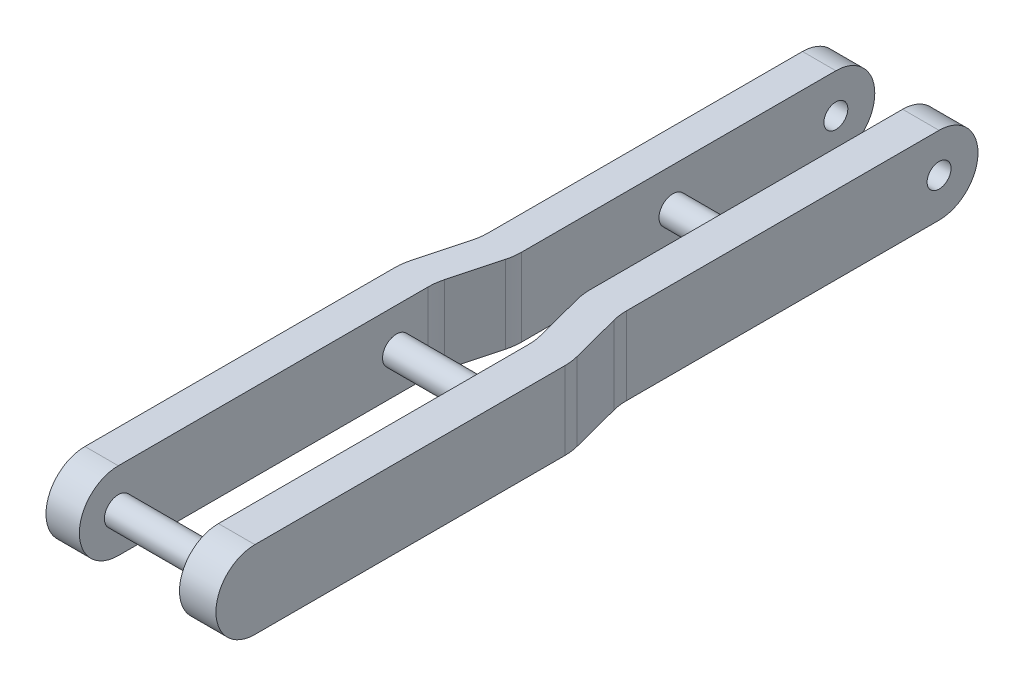
ISO-10303-21;
HEADER;
FILE_DESCRIPTION(('STEP AP214'),'2;1');
FILE_NAME('part.step','',(''),(''),'','','');
FILE_SCHEMA(('AUTOMOTIVE_DESIGN { 1 0 10303 214 1 1 1 1 }'));
ENDSEC;
DATA;
#1=APPLICATION_CONTEXT('core data for automotive mechanical design processes');
#2=APPLICATION_PROTOCOL_DEFINITION('international standard','automotive_design',2000,#1);
#3=PRODUCT_CONTEXT('',#1,'mechanical');
#4=PRODUCT('Part','Part','',(#3));
#5=PRODUCT_RELATED_PRODUCT_CATEGORY('part','',(#4));
#6=PRODUCT_DEFINITION_FORMATION('','',#4);
#7=PRODUCT_DEFINITION_CONTEXT('part definition',#1,'design');
#8=PRODUCT_DEFINITION('design','',#6,#7);
#9=PRODUCT_DEFINITION_SHAPE('','',#8);
#10=(LENGTH_UNIT() NAMED_UNIT(*) SI_UNIT(.MILLI.,.METRE.));
#11=(NAMED_UNIT(*) PLANE_ANGLE_UNIT() SI_UNIT($,.RADIAN.));
#12=(NAMED_UNIT(*) SI_UNIT($,.STERADIAN.) SOLID_ANGLE_UNIT());
#13=UNCERTAINTY_MEASURE_WITH_UNIT(LENGTH_MEASURE(1.E-05),#10,'distance_accuracy_value','');
#14=(GEOMETRIC_REPRESENTATION_CONTEXT(3) GLOBAL_UNCERTAINTY_ASSIGNED_CONTEXT((#13)) GLOBAL_UNIT_ASSIGNED_CONTEXT((#10,
#11,#12)) REPRESENTATION_CONTEXT('',''));
#15=CARTESIAN_POINT('',(0.,0.,0.));
#16=DIRECTION('',(0.,0.,1.));
#17=DIRECTION('',(1.,0.,0.));
#18=AXIS2_PLACEMENT_3D('',#15,#16,#17);
#19=CARTESIAN_POINT('',(2.,7.,-133.));
#20=DIRECTION('',(-1.,0.,0.));
#21=DIRECTION('',(0.,0.,1.));
#22=AXIS2_PLACEMENT_3D('',#19,#20,#21);
#23=CYLINDRICAL_SURFACE('',#22,7.);
#24=DIRECTION('',(1.,0.,0.));
#25=VECTOR('',#24,1.);
#26=CARTESIAN_POINT('',(2.,14.,-133.));
#27=LINE('',#26,#25);
#28=CARTESIAN_POINT('',(2.,14.,-133.));
#29=VERTEX_POINT('',#28);
#30=CARTESIAN_POINT('',(-4.55341928222709,14.,-133.));
#31=VERTEX_POINT('',#30);
#32=EDGE_CURVE('E337',#29,#31,#27,.F.);
#33=ORIENTED_EDGE('',*,*,#32,.F.);
#34=CARTESIAN_POINT('',(2.,7.,-133.));
#35=DIRECTION('',(-1.,0.,0.));
#36=DIRECTION('',(0.,0.,1.));
#37=AXIS2_PLACEMENT_3D('',#34,#35,#36);
#38=CIRCLE('',#37,7.);
#39=CARTESIAN_POINT('',(2.,0.,-133.));
#40=VERTEX_POINT('',#39);
#41=EDGE_CURVE('E56',#40,#29,#38,.F.);
#42=ORIENTED_EDGE('',*,*,#41,.F.);
#43=DIRECTION('',(-1.,0.,0.));
#44=VECTOR('',#43,1.);
#45=CARTESIAN_POINT('',(-11.5534192822271,0.,-133.));
#46=LINE('',#45,#44);
#47=CARTESIAN_POINT('',(-4.55341928222709,0.,-133.));
#48=VERTEX_POINT('',#47);
#49=EDGE_CURVE('E340',#48,#40,#46,.F.);
#50=ORIENTED_EDGE('',*,*,#49,.F.);
#51=CARTESIAN_POINT('',(-4.55341928222709,7.,-133.));
#52=DIRECTION('',(1.,0.,0.));
#53=DIRECTION('',(0.,0.,-1.));
#54=AXIS2_PLACEMENT_3D('',#51,#52,#53);
#55=CIRCLE('',#54,7.);
#56=EDGE_CURVE('E64',#31,#48,#55,.F.);
#57=ORIENTED_EDGE('',*,*,#56,.F.);
#58=EDGE_LOOP('',(#33,#42,#50,#57));
#59=FACE_BOUND('',#58,.T.);
#60=ADVANCED_FACE('F41',(#59),#23,.T.);
#61=CARTESIAN_POINT('',(-1.55341928222709,7.,-7.));
#62=DIRECTION('',(1.,0.,0.));
#63=DIRECTION('',(0.,0.,-1.));
#64=AXIS2_PLACEMENT_3D('',#61,#62,#63);
#65=CYLINDRICAL_SURFACE('',#64,7.);
#66=DIRECTION('',(-1.,0.,0.));
#67=VECTOR('',#66,1.);
#68=CARTESIAN_POINT('',(-1.55341928222709,14.,-7.));
#69=LINE('',#68,#67);
#70=CARTESIAN_POINT('',(-1.55341928222709,14.,-7.));
#71=VERTEX_POINT('',#70);
#72=CARTESIAN_POINT('',(5.,14.,-7.));
#73=VERTEX_POINT('',#72);
#74=EDGE_CURVE('E327',#71,#73,#69,.F.);
#75=ORIENTED_EDGE('',*,*,#74,.F.);
#76=CARTESIAN_POINT('',(-1.55341928222709,7.,-7.));
#77=DIRECTION('',(1.,0.,0.));
#78=DIRECTION('',(0.,0.,-1.));
#79=AXIS2_PLACEMENT_3D('',#76,#77,#78);
#80=CIRCLE('',#79,7.);
#81=CARTESIAN_POINT('',(-1.55341928222709,0.,-7.));
#82=VERTEX_POINT('',#81);
#83=EDGE_CURVE('E333',#82,#71,#80,.F.);
#84=ORIENTED_EDGE('',*,*,#83,.F.);
#85=DIRECTION('',(1.,0.,0.));
#86=VECTOR('',#85,1.);
#87=CARTESIAN_POINT('',(-11.5534192822271,0.,-7.));
#88=LINE('',#87,#86);
#89=CARTESIAN_POINT('',(5.,0.,-7.));
#90=VERTEX_POINT('',#89);
#91=EDGE_CURVE('E330',#90,#82,#88,.F.);
#92=ORIENTED_EDGE('',*,*,#91,.F.);
#93=CARTESIAN_POINT('',(5.,7.,-7.));
#94=DIRECTION('',(-1.,0.,0.));
#95=DIRECTION('',(0.,0.,1.));
#96=AXIS2_PLACEMENT_3D('',#93,#94,#95);
#97=CIRCLE('',#96,7.);
#98=EDGE_CURVE('E335',#73,#90,#97,.F.);
#99=ORIENTED_EDGE('',*,*,#98,.F.);
#100=EDGE_LOOP('',(#75,#84,#92,#99));
#101=FACE_BOUND('',#100,.T.);
#102=ADVANCED_FACE('F485',(#101),#65,.T.);
#103=CARTESIAN_POINT('',(5.,14.,0.));
#104=DIRECTION('',(-1.,0.,0.));
#105=DIRECTION('',(0.,0.,1.));
#106=AXIS2_PLACEMENT_3D('',#103,#104,#105);
#107=PLANE('',#106);
#108=DIRECTION('',(0.,0.,-1.));
#109=VECTOR('',#108,1.);
#110=CARTESIAN_POINT('',(5.,14.,0.));
#111=LINE('',#110,#109);
#112=CARTESIAN_POINT('',(5.,14.,-62.7180489145873));
#113=VERTEX_POINT('',#112);
#114=EDGE_CURVE('E260',#73,#113,#111,.T.);
#115=ORIENTED_EDGE('',*,*,#114,.F.);
#116=ORIENTED_EDGE('',*,*,#98,.T.);
#117=DIRECTION('',(0.,0.,-1.));
#118=VECTOR('',#117,1.);
#119=CARTESIAN_POINT('',(5.,0.,0.));
#120=LINE('',#119,#118);
#121=CARTESIAN_POINT('',(5.,0.,-62.7180489145873));
#122=VERTEX_POINT('',#121);
#123=EDGE_CURVE('E259',#90,#122,#120,.T.);
#124=ORIENTED_EDGE('',*,*,#123,.T.);
#125=DIRECTION('',(0.,-1.,0.));
#126=VECTOR('',#125,1.);
#127=CARTESIAN_POINT('',(5.,14.,-62.7180489145873));
#128=LINE('',#127,#126);
#129=EDGE_CURVE('E324',#113,#122,#128,.T.);
#130=ORIENTED_EDGE('',*,*,#129,.F.);
#131=EDGE_LOOP('',(#115,#116,#124,#130));
#132=FACE_BOUND('',#131,.T.);
#133=ADVANCED_FACE('F491',(#132),#107,.F.);
#134=CARTESIAN_POINT('',(-5.,14.,-62.7180489145873));
#135=DIRECTION('',(0.,-1.,0.));
#136=DIRECTION('',(0.,0.,-1.));
#137=AXIS2_PLACEMENT_3D('',#134,#135,#136);
#138=CYLINDRICAL_SURFACE('',#137,10.);
#139=CARTESIAN_POINT('',(-5.,0.,-62.7180489145873));
#140=DIRECTION('',(0.,1.,0.));
#141=DIRECTION('',(0.,0.,1.));
#142=AXIS2_PLACEMENT_3D('',#139,#140,#141);
#143=CIRCLE('',#142,10.);
#144=CARTESIAN_POINT('',(4.67663446750844,0.,-65.2404972058765));
#145=VERTEX_POINT('',#144);
#146=EDGE_CURVE('E285',#122,#145,#143,.T.);
#147=ORIENTED_EDGE('',*,*,#146,.T.);
#148=DIRECTION('',(0.,-1.,0.));
#149=VECTOR('',#148,1.);
#150=CARTESIAN_POINT('',(4.67663446750844,14.,-65.2404972058765));
#151=LINE('',#150,#149);
#152=CARTESIAN_POINT('',(4.67663446750844,14.,-65.2404972058765));
#153=VERTEX_POINT('',#152);
#154=EDGE_CURVE('E321',#153,#145,#151,.T.);
#155=ORIENTED_EDGE('',*,*,#154,.F.);
#156=CARTESIAN_POINT('',(-5.,14.,-62.7180489145873));
#157=DIRECTION('',(0.,1.,0.));
#158=DIRECTION('',(0.,0.,1.));
#159=AXIS2_PLACEMENT_3D('',#156,#157,#158);
#160=CIRCLE('',#159,10.);
#161=EDGE_CURVE('E262',#113,#153,#160,.T.);
#162=ORIENTED_EDGE('',*,*,#161,.F.);
#163=ORIENTED_EDGE('',*,*,#129,.T.);
#164=EDGE_LOOP('',(#147,#155,#162,#163));
#165=FACE_BOUND('',#164,.T.);
#166=ADVANCED_FACE('F537',(#165),#138,.T.);
#167=CARTESIAN_POINT('',(4.67663446750844,14.,-65.2404972058765));
#168=DIRECTION('',(-0.967663446750844,0.,0.252244829128915));
#169=DIRECTION('',(0.252244829128915,0.,0.967663446750844));
#170=AXIS2_PLACEMENT_3D('',#167,#168,#169);
#171=PLANE('',#170);
#172=DIRECTION('',(-0.252244829128915,0.,-0.967663446750844));
#173=VECTOR('',#172,1.);
#174=CARTESIAN_POINT('',(4.67663446750844,0.,-65.2404972058765));
#175=LINE('',#174,#173);
#176=CARTESIAN_POINT('',(2.32336553249156,0.,-74.2681245973039));
#177=VERTEX_POINT('',#176);
#178=EDGE_CURVE('E287',#145,#177,#175,.T.);
#179=ORIENTED_EDGE('',*,*,#178,.T.);
#180=DIRECTION('',(0.,-1.,0.));
#181=VECTOR('',#180,1.);
#182=CARTESIAN_POINT('',(2.32336553249156,14.,-74.2681245973039));
#183=LINE('',#182,#181);
#184=CARTESIAN_POINT('',(2.32336553249156,14.,-74.2681245973039));
#185=VERTEX_POINT('',#184);
#186=EDGE_CURVE('E318',#185,#177,#183,.T.);
#187=ORIENTED_EDGE('',*,*,#186,.F.);
#188=DIRECTION('',(-0.252244829128915,0.,-0.967663446750844));
#189=VECTOR('',#188,1.);
#190=CARTESIAN_POINT('',(4.67663446750844,14.,-65.2404972058765));
#191=LINE('',#190,#189);
#192=EDGE_CURVE('E265',#153,#185,#191,.T.);
#193=ORIENTED_EDGE('',*,*,#192,.F.);
#194=ORIENTED_EDGE('',*,*,#154,.T.);
#195=EDGE_LOOP('',(#179,#187,#193,#194));
#196=FACE_BOUND('',#195,.T.);
#197=ADVANCED_FACE('F541',(#196),#171,.F.);
#198=CARTESIAN_POINT('',(12.,14.,-76.7905728885931));
#199=DIRECTION('',(0.,-1.,0.));
#200=DIRECTION('',(0.,0.,-1.));
#201=AXIS2_PLACEMENT_3D('',#198,#199,#200);
#202=CYLINDRICAL_SURFACE('',#201,10.);
#203=CARTESIAN_POINT('',(12.,0.,-76.7905728885931));
#204=DIRECTION('',(0.,-1.,0.));
#205=DIRECTION('',(0.,0.,-1.));
#206=AXIS2_PLACEMENT_3D('',#203,#204,#205);
#207=CIRCLE('',#206,10.);
#208=CARTESIAN_POINT('',(2.,0.,-76.7905728885931));
#209=VERTEX_POINT('',#208);
#210=EDGE_CURVE('E289',#177,#209,#207,.T.);
#211=ORIENTED_EDGE('',*,*,#210,.T.);
#212=DIRECTION('',(0.,-1.,0.));
#213=VECTOR('',#212,1.);
#214=CARTESIAN_POINT('',(2.,14.,-76.7905728885931));
#215=LINE('',#214,#213);
#216=CARTESIAN_POINT('',(2.,14.,-76.7905728885931));
#217=VERTEX_POINT('',#216);
#218=EDGE_CURVE('E315',#217,#209,#215,.T.);
#219=ORIENTED_EDGE('',*,*,#218,.F.);
#220=CARTESIAN_POINT('',(12.,14.,-76.7905728885931));
#221=DIRECTION('',(0.,-1.,0.));
#222=DIRECTION('',(0.,0.,-1.));
#223=AXIS2_PLACEMENT_3D('',#220,#221,#222);
#224=CIRCLE('',#223,10.);
#225=EDGE_CURVE('E267',#185,#217,#224,.T.);
#226=ORIENTED_EDGE('',*,*,#225,.F.);
#227=ORIENTED_EDGE('',*,*,#186,.T.);
#228=EDGE_LOOP('',(#211,#219,#226,#227));
#229=FACE_BOUND('',#228,.T.);
#230=ADVANCED_FACE('F543',(#229),#202,.F.);
#231=CARTESIAN_POINT('',(2.,14.,-76.7905728885931));
#232=DIRECTION('',(-1.,0.,0.));
#233=DIRECTION('',(0.,0.,1.));
#234=AXIS2_PLACEMENT_3D('',#231,#232,#233);
#235=PLANE('',#234);
#236=CARTESIAN_POINT('',(2.,7.,-133.));
#237=DIRECTION('',(1.,0.,0.));
#238=DIRECTION('',(0.,0.,-1.));
#239=AXIS2_PLACEMENT_3D('',#236,#237,#238);
#240=CIRCLE('',#239,2.15000000000002);
#241=CARTESIAN_POINT('',(2.,7.,-135.15));
#242=VERTEX_POINT('',#241);
#243=EDGE_CURVE('E253',#242,#242,#240,.T.);
#244=ORIENTED_EDGE('',*,*,#243,.F.);
#245=EDGE_LOOP('',(#244));
#246=FACE_BOUND('',#245,.T.);
#247=DIRECTION('',(0.,0.,-1.));
#248=VECTOR('',#247,1.);
#249=CARTESIAN_POINT('',(2.,0.,-76.7905728885931));
#250=LINE('',#249,#248);
#251=EDGE_CURVE('E291',#209,#40,#250,.T.);
#252=ORIENTED_EDGE('',*,*,#251,.T.);
#253=ORIENTED_EDGE('',*,*,#41,.T.);
#254=DIRECTION('',(0.,0.,-1.));
#255=VECTOR('',#254,1.);
#256=CARTESIAN_POINT('',(2.,14.,-76.7905728885931));
#257=LINE('',#256,#255);
#258=EDGE_CURVE('E269',#217,#29,#257,.T.);
#259=ORIENTED_EDGE('',*,*,#258,.F.);
#260=ORIENTED_EDGE('',*,*,#218,.T.);
#261=EDGE_LOOP('',(#252,#253,#259,#260));
#262=FACE_BOUND('',#261,.T.);
#263=ADVANCED_FACE('F499',(#246,#262),#235,.F.);
#264=CARTESIAN_POINT('',(-4.55341928222709,14.,-76.7905728885931));
#265=DIRECTION('',(1.,0.,0.));
#266=DIRECTION('',(0.,0.,-1.));
#267=AXIS2_PLACEMENT_3D('',#264,#265,#266);
#268=PLANE('',#267);
#269=CARTESIAN_POINT('',(-4.55341928222709,7.,-103.7));
#270=DIRECTION('',(1.,0.,0.));
#271=DIRECTION('',(0.,0.,-1.));
#272=AXIS2_PLACEMENT_3D('',#269,#270,#271);
#273=CIRCLE('',#272,2.49999999999999);
#274=CARTESIAN_POINT('',(-4.55341928222709,7.,-106.2));
#275=VERTEX_POINT('',#274);
#276=EDGE_CURVE('E11',#275,#275,#273,.F.);
#277=ORIENTED_EDGE('',*,*,#276,.F.);
#278=EDGE_LOOP('',(#277));
#279=FACE_BOUND('',#278,.T.);
#280=CARTESIAN_POINT('',(-4.55341928222709,7.,-133.));
#281=DIRECTION('',(1.,0.,0.));
#282=DIRECTION('',(0.,0.,-1.));
#283=AXIS2_PLACEMENT_3D('',#280,#281,#282);
#284=CIRCLE('',#283,2.15000000000002);
#285=CARTESIAN_POINT('',(-4.55341928222709,7.,-135.15));
#286=VERTEX_POINT('',#285);
#287=EDGE_CURVE('E256',#286,#286,#284,.F.);
#288=ORIENTED_EDGE('',*,*,#287,.F.);
#289=EDGE_LOOP('',(#288));
#290=FACE_BOUND('',#289,.T.);
#291=DIRECTION('',(0.,0.,1.));
#292=VECTOR('',#291,1.);
#293=CARTESIAN_POINT('',(-4.55341928222709,14.,-76.7905728885931));
#294=LINE('',#293,#292);
#295=CARTESIAN_POINT('',(-4.55341928222709,14.,-76.7905728885931));
#296=VERTEX_POINT('',#295);
#297=EDGE_CURVE('E272',#31,#296,#294,.T.);
#298=ORIENTED_EDGE('',*,*,#297,.F.);
#299=ORIENTED_EDGE('',*,*,#56,.T.);
#300=DIRECTION('',(0.,0.,1.));
#301=VECTOR('',#300,1.);
#302=CARTESIAN_POINT('',(-4.55341928222709,0.,-76.7905728885931));
#303=LINE('',#302,#301);
#304=CARTESIAN_POINT('',(-4.55341928222709,0.,-76.7905728885931));
#305=VERTEX_POINT('',#304);
#306=EDGE_CURVE('E294',#48,#305,#303,.T.);
#307=ORIENTED_EDGE('',*,*,#306,.T.);
#308=DIRECTION('',(0.,-1.,0.));
#309=VECTOR('',#308,1.);
#310=CARTESIAN_POINT('',(-4.55341928222709,14.,-76.7905728885931));
#311=LINE('',#310,#309);
#312=EDGE_CURVE('E312',#296,#305,#311,.T.);
#313=ORIENTED_EDGE('',*,*,#312,.F.);
#314=EDGE_LOOP('',(#298,#299,#307,#313));
#315=FACE_BOUND('',#314,.T.);
#316=ADVANCED_FACE('F509',(#279,#290,#315),#268,.F.);
#317=CARTESIAN_POINT('',(5.44658071777291,14.,-76.7905728885931));
#318=DIRECTION('',(0.,-1.,0.));
#319=DIRECTION('',(0.,0.,-1.));
#320=AXIS2_PLACEMENT_3D('',#317,#318,#319);
#321=CYLINDRICAL_SURFACE('',#320,10.);
#322=CARTESIAN_POINT('',(5.44658071777291,0.,-76.7905728885931));
#323=DIRECTION('',(0.,1.,0.));
#324=DIRECTION('',(0.,0.,-1.));
#325=AXIS2_PLACEMENT_3D('',#322,#323,#324);
#326=CIRCLE('',#325,10.);
#327=CARTESIAN_POINT('',(-4.23005374973553,0.,-74.2681245973039));
#328=VERTEX_POINT('',#327);
#329=EDGE_CURVE('E296',#305,#328,#326,.T.);
#330=ORIENTED_EDGE('',*,*,#329,.T.);
#331=DIRECTION('',(0.,-1.,0.));
#332=VECTOR('',#331,1.);
#333=CARTESIAN_POINT('',(-4.23005374973553,14.,-74.2681245973039));
#334=LINE('',#333,#332);
#335=CARTESIAN_POINT('',(-4.23005374973553,14.,-74.2681245973039));
#336=VERTEX_POINT('',#335);
#337=EDGE_CURVE('E309',#336,#328,#334,.T.);
#338=ORIENTED_EDGE('',*,*,#337,.F.);
#339=CARTESIAN_POINT('',(5.44658071777291,14.,-76.7905728885931));
#340=DIRECTION('',(0.,1.,0.));
#341=DIRECTION('',(0.,0.,-1.));
#342=AXIS2_PLACEMENT_3D('',#339,#340,#341);
#343=CIRCLE('',#342,10.);
#344=EDGE_CURVE('E274',#296,#336,#343,.T.);
#345=ORIENTED_EDGE('',*,*,#344,.F.);
#346=ORIENTED_EDGE('',*,*,#312,.T.);
#347=EDGE_LOOP('',(#330,#338,#345,#346));
#348=FACE_BOUND('',#347,.T.);
#349=ADVANCED_FACE('F512',(#348),#321,.T.);
#350=CARTESIAN_POINT('',(-1.87678481471865,14.,-65.2404972058765));
#351=DIRECTION('',(0.967663446750844,0.,-0.252244829128915));
#352=DIRECTION('',(-0.252244829128915,0.,-0.967663446750844));
#353=AXIS2_PLACEMENT_3D('',#350,#351,#352);
#354=PLANE('',#353);
#355=DIRECTION('',(0.252244829128915,0.,0.967663446750844));
#356=VECTOR('',#355,1.);
#357=CARTESIAN_POINT('',(-1.87678481471865,0.,-65.2404972058765));
#358=LINE('',#357,#356);
#359=CARTESIAN_POINT('',(-1.87678481471865,0.,-65.2404972058765));
#360=VERTEX_POINT('',#359);
#361=EDGE_CURVE('E298',#328,#360,#358,.T.);
#362=ORIENTED_EDGE('',*,*,#361,.T.);
#363=DIRECTION('',(0.,-1.,0.));
#364=VECTOR('',#363,1.);
#365=CARTESIAN_POINT('',(-1.87678481471865,14.,-65.2404972058765));
#366=LINE('',#365,#364);
#367=CARTESIAN_POINT('',(-1.87678481471865,14.,-65.2404972058765));
#368=VERTEX_POINT('',#367);
#369=EDGE_CURVE('E306',#368,#360,#366,.T.);
#370=ORIENTED_EDGE('',*,*,#369,.F.);
#371=DIRECTION('',(0.252244829128915,0.,0.967663446750844));
#372=VECTOR('',#371,1.);
#373=CARTESIAN_POINT('',(-1.87678481471865,14.,-65.2404972058765));
#374=LINE('',#373,#372);
#375=EDGE_CURVE('E276',#336,#368,#374,.T.);
#376=ORIENTED_EDGE('',*,*,#375,.F.);
#377=ORIENTED_EDGE('',*,*,#337,.T.);
#378=EDGE_LOOP('',(#362,#370,#376,#377));
#379=FACE_BOUND('',#378,.T.);
#380=ADVANCED_FACE('F519',(#379),#354,.F.);
#381=CARTESIAN_POINT('',(-11.5534192822271,14.,-62.7180489145873));
#382=DIRECTION('',(0.,-1.,0.));
#383=DIRECTION('',(0.,0.,-1.));
#384=AXIS2_PLACEMENT_3D('',#381,#382,#383);
#385=CYLINDRICAL_SURFACE('',#384,10.);
#386=CARTESIAN_POINT('',(-11.5534192822271,0.,-62.7180489145873));
#387=DIRECTION('',(0.,-1.,0.));
#388=DIRECTION('',(0.,0.,1.));
#389=AXIS2_PLACEMENT_3D('',#386,#387,#388);
#390=CIRCLE('',#389,10.);
#391=CARTESIAN_POINT('',(-1.55341928222709,0.,-62.7180489145873));
#392=VERTEX_POINT('',#391);
#393=EDGE_CURVE('E300',#360,#392,#390,.T.);
#394=ORIENTED_EDGE('',*,*,#393,.T.);
#395=DIRECTION('',(0.,-1.,0.));
#396=VECTOR('',#395,1.);
#397=CARTESIAN_POINT('',(-1.55341928222709,14.,-62.7180489145873));
#398=LINE('',#397,#396);
#399=CARTESIAN_POINT('',(-1.55341928222709,14.,-62.7180489145873));
#400=VERTEX_POINT('',#399);
#401=EDGE_CURVE('E283',#400,#392,#398,.T.);
#402=ORIENTED_EDGE('',*,*,#401,.F.);
#403=CARTESIAN_POINT('',(-11.5534192822271,14.,-62.7180489145873));
#404=DIRECTION('',(0.,-1.,0.));
#405=DIRECTION('',(0.,0.,1.));
#406=AXIS2_PLACEMENT_3D('',#403,#404,#405);
#407=CIRCLE('',#406,10.);
#408=EDGE_CURVE('E278',#368,#400,#407,.T.);
#409=ORIENTED_EDGE('',*,*,#408,.F.);
#410=ORIENTED_EDGE('',*,*,#369,.T.);
#411=EDGE_LOOP('',(#394,#402,#409,#410));
#412=FACE_BOUND('',#411,.T.);
#413=ADVANCED_FACE('F522',(#412),#385,.F.);
#414=CARTESIAN_POINT('',(-1.55341928222709,14.,0.));
#415=DIRECTION('',(1.,0.,0.));
#416=DIRECTION('',(0.,0.,-1.));
#417=AXIS2_PLACEMENT_3D('',#414,#415,#416);
#418=PLANE('',#417);
#419=CARTESIAN_POINT('',(-1.55341928222709,7.,-57.));
#420=DIRECTION('',(1.,0.,0.));
#421=DIRECTION('',(0.,0.,-1.));
#422=AXIS2_PLACEMENT_3D('',#419,#420,#421);
#423=CIRCLE('',#422,2.5);
#424=CARTESIAN_POINT('',(-1.55341928222709,7.,-59.5));
#425=VERTEX_POINT('',#424);
#426=EDGE_CURVE('E350',#425,#425,#423,.F.);
#427=ORIENTED_EDGE('',*,*,#426,.F.);
#428=EDGE_LOOP('',(#427));
#429=FACE_BOUND('',#428,.T.);
#430=CARTESIAN_POINT('',(-1.55341928222709,7.,-7.));
#431=DIRECTION('',(1.,0.,0.));
#432=DIRECTION('',(0.,0.,-1.));
#433=AXIS2_PLACEMENT_3D('',#430,#431,#432);
#434=CIRCLE('',#433,2.5);
#435=CARTESIAN_POINT('',(-1.55341928222709,7.,-9.5));
#436=VERTEX_POINT('',#435);
#437=EDGE_CURVE('E344',#436,#436,#434,.F.);
#438=ORIENTED_EDGE('',*,*,#437,.F.);
#439=EDGE_LOOP('',(#438));
#440=FACE_BOUND('',#439,.T.);
#441=DIRECTION('',(0.,0.,1.));
#442=VECTOR('',#441,1.);
#443=CARTESIAN_POINT('',(-1.55341928222709,0.,0.));
#444=LINE('',#443,#442);
#445=EDGE_CURVE('E263',#392,#82,#444,.T.);
#446=ORIENTED_EDGE('',*,*,#445,.T.);
#447=ORIENTED_EDGE('',*,*,#83,.T.);
#448=DIRECTION('',(0.,0.,1.));
#449=VECTOR('',#448,1.);
#450=CARTESIAN_POINT('',(-1.55341928222709,14.,0.));
#451=LINE('',#450,#449);
#452=EDGE_CURVE('E280',#400,#71,#451,.T.);
#453=ORIENTED_EDGE('',*,*,#452,.F.);
#454=ORIENTED_EDGE('',*,*,#401,.T.);
#455=EDGE_LOOP('',(#446,#447,#453,#454));
#456=FACE_BOUND('',#455,.T.);
#457=ADVANCED_FACE('F526',(#429,#440,#456),#418,.F.);
#458=CARTESIAN_POINT('',(-11.5534192822271,14.,-62.7180489145873));
#459=DIRECTION('',(0.,1.,0.));
#460=DIRECTION('',(0.,0.,1.));
#461=AXIS2_PLACEMENT_3D('',#458,#459,#460);
#462=PLANE('',#461);
#463=ORIENTED_EDGE('',*,*,#258,.T.);
#464=ORIENTED_EDGE('',*,*,#32,.T.);
#465=ORIENTED_EDGE('',*,*,#297,.T.);
#466=ORIENTED_EDGE('',*,*,#344,.T.);
#467=ORIENTED_EDGE('',*,*,#375,.T.);
#468=ORIENTED_EDGE('',*,*,#408,.T.);
#469=ORIENTED_EDGE('',*,*,#452,.T.);
#470=ORIENTED_EDGE('',*,*,#74,.T.);
#471=ORIENTED_EDGE('',*,*,#114,.T.);
#472=ORIENTED_EDGE('',*,*,#161,.T.);
#473=ORIENTED_EDGE('',*,*,#192,.T.);
#474=ORIENTED_EDGE('',*,*,#225,.T.);
#475=EDGE_LOOP('',(#463,#464,#465,#466,#467,#468,#469,#470,#471,#472,#473,#474));
#476=FACE_BOUND('',#475,.T.);
#477=ADVANCED_FACE('F495',(#476),#462,.T.);
#478=CARTESIAN_POINT('',(-11.5534192822271,0.,-62.7180489145873));
#479=DIRECTION('',(0.,1.,0.));
#480=DIRECTION('',(0.,0.,1.));
#481=AXIS2_PLACEMENT_3D('',#478,#479,#480);
#482=PLANE('',#481);
#483=ORIENTED_EDGE('',*,*,#306,.F.);
#484=ORIENTED_EDGE('',*,*,#49,.T.);
#485=ORIENTED_EDGE('',*,*,#251,.F.);
#486=ORIENTED_EDGE('',*,*,#210,.F.);
#487=ORIENTED_EDGE('',*,*,#178,.F.);
#488=ORIENTED_EDGE('',*,*,#146,.F.);
#489=ORIENTED_EDGE('',*,*,#123,.F.);
#490=ORIENTED_EDGE('',*,*,#91,.T.);
#491=ORIENTED_EDGE('',*,*,#445,.F.);
#492=ORIENTED_EDGE('',*,*,#393,.F.);
#493=ORIENTED_EDGE('',*,*,#361,.F.);
#494=ORIENTED_EDGE('',*,*,#329,.F.);
#495=EDGE_LOOP('',(#483,#484,#485,#486,#487,#488,#489,#490,#491,#492,#493,#494));
#496=FACE_BOUND('',#495,.T.);
#497=ADVANCED_FACE('F504',(#496),#482,.F.);
#498=CARTESIAN_POINT('',(-4.55441928222709,7.,-133.));
#499=DIRECTION('',(1.,0.,0.));
#500=DIRECTION('',(0.,0.,-1.));
#501=AXIS2_PLACEMENT_3D('',#498,#499,#500);
#502=CYLINDRICAL_SURFACE('',#501,2.15000000000002);
#503=ORIENTED_EDGE('',*,*,#243,.T.);
#504=EDGE_LOOP('',(#503));
#505=FACE_BOUND('',#504,.T.);
#506=ORIENTED_EDGE('',*,*,#287,.T.);
#507=EDGE_LOOP('',(#506));
#508=FACE_BOUND('',#507,.T.);
#509=ADVANCED_FACE('F480',(#505,#508),#502,.F.);
#510=CARTESIAN_POINT('',(5.00200000000001,7.,-7.));
#511=DIRECTION('',(-1.,0.,0.));
#512=DIRECTION('',(0.,0.,1.));
#513=AXIS2_PLACEMENT_3D('',#510,#511,#512);
#514=CYLINDRICAL_SURFACE('',#513,2.5);
#515=CARTESIAN_POINT('',(-19.5534192822271,7.,-7.));
#516=DIRECTION('',(-1.,0.,0.));
#517=DIRECTION('',(0.,0.,1.));
#518=AXIS2_PLACEMENT_3D('',#515,#516,#517);
#519=CIRCLE('',#518,2.5);
#520=CARTESIAN_POINT('',(-19.5534192822271,7.,-4.5));
#521=VERTEX_POINT('',#520);
#522=EDGE_CURVE('E250',#521,#521,#519,.T.);
#523=ORIENTED_EDGE('',*,*,#522,.F.);
#524=EDGE_LOOP('',(#523));
#525=FACE_BOUND('',#524,.T.);
#526=ORIENTED_EDGE('',*,*,#437,.T.);
#527=EDGE_LOOP('',(#526));
#528=FACE_BOUND('',#527,.T.);
#529=ADVANCED_FACE('F473',(#525,#528),#514,.T.);
#530=CARTESIAN_POINT('',(-19.5534192822271,7.,-7.));
#531=DIRECTION('',(1.,0.,0.));
#532=DIRECTION('',(0.,0.,-1.));
#533=AXIS2_PLACEMENT_3D('',#530,#531,#532);
#534=CYLINDRICAL_SURFACE('',#533,7.);
#535=DIRECTION('',(-1.,0.,0.));
#536=VECTOR('',#535,1.);
#537=CARTESIAN_POINT('',(-19.5534192822271,0.,-7.));
#538=LINE('',#537,#536);
#539=CARTESIAN_POINT('',(-19.5534192822271,0.,-7.));
#540=VERTEX_POINT('',#539);
#541=CARTESIAN_POINT('',(-25.5534192822271,0.,-7.));
#542=VERTEX_POINT('',#541);
#543=EDGE_CURVE('E242',#540,#542,#538,.T.);
#544=ORIENTED_EDGE('',*,*,#543,.F.);
#545=CARTESIAN_POINT('',(-19.5534192822271,7.,-7.));
#546=DIRECTION('',(-1.,0.,0.));
#547=DIRECTION('',(0.,0.,1.));
#548=AXIS2_PLACEMENT_3D('',#545,#546,#547);
#549=CIRCLE('',#548,7.);
#550=CARTESIAN_POINT('',(-19.5534192822271,14.,-7.));
#551=VERTEX_POINT('',#550);
#552=EDGE_CURVE('E246',#551,#540,#549,.F.);
#553=ORIENTED_EDGE('',*,*,#552,.F.);
#554=DIRECTION('',(1.,0.,0.));
#555=VECTOR('',#554,1.);
#556=CARTESIAN_POINT('',(-15.5534192822271,14.,-7.));
#557=LINE('',#556,#555);
#558=CARTESIAN_POINT('',(-25.5534192822271,14.,-7.));
#559=VERTEX_POINT('',#558);
#560=EDGE_CURVE('E209',#559,#551,#557,.T.);
#561=ORIENTED_EDGE('',*,*,#560,.F.);
#562=CARTESIAN_POINT('',(-25.5534192822271,7.,-7.));
#563=DIRECTION('',(1.,0.,0.));
#564=DIRECTION('',(0.,0.,-1.));
#565=AXIS2_PLACEMENT_3D('',#562,#563,#564);
#566=CIRCLE('',#565,7.);
#567=EDGE_CURVE('E248',#542,#559,#566,.F.);
#568=ORIENTED_EDGE('',*,*,#567,.F.);
#569=EDGE_LOOP('',(#544,#553,#561,#568));
#570=FACE_BOUND('',#569,.T.);
#571=ADVANCED_FACE('F471',(#570),#534,.T.);
#572=CARTESIAN_POINT('',(-16.5534192822271,7.,-133.));
#573=DIRECTION('',(-1.,0.,0.));
#574=DIRECTION('',(0.,0.,1.));
#575=AXIS2_PLACEMENT_3D('',#572,#573,#574);
#576=CYLINDRICAL_SURFACE('',#575,7.);
#577=DIRECTION('',(-1.,0.,0.));
#578=VECTOR('',#577,1.);
#579=CARTESIAN_POINT('',(-15.5534192822267,14.,-133.));
#580=LINE('',#579,#578);
#581=CARTESIAN_POINT('',(-16.5534192822271,14.,-133.));
#582=VERTEX_POINT('',#581);
#583=CARTESIAN_POINT('',(-22.5534192822271,14.,-133.));
#584=VERTEX_POINT('',#583);
#585=EDGE_CURVE('E227',#582,#584,#580,.T.);
#586=ORIENTED_EDGE('',*,*,#585,.F.);
#587=CARTESIAN_POINT('',(-16.5534192822271,7.,-133.));
#588=DIRECTION('',(-1.,0.,0.));
#589=DIRECTION('',(0.,0.,1.));
#590=AXIS2_PLACEMENT_3D('',#587,#588,#589);
#591=CIRCLE('',#590,7.);
#592=CARTESIAN_POINT('',(-16.5534192822271,0.,-133.));
#593=VERTEX_POINT('',#592);
#594=EDGE_CURVE('E238',#593,#582,#591,.F.);
#595=ORIENTED_EDGE('',*,*,#594,.F.);
#596=DIRECTION('',(1.,0.,0.));
#597=VECTOR('',#596,1.);
#598=CARTESIAN_POINT('',(-16.5534192822271,0.,-133.));
#599=LINE('',#598,#597);
#600=CARTESIAN_POINT('',(-22.5534192822271,0.,-133.));
#601=VERTEX_POINT('',#600);
#602=EDGE_CURVE('E230',#601,#593,#599,.T.);
#603=ORIENTED_EDGE('',*,*,#602,.F.);
#604=CARTESIAN_POINT('',(-22.5534192822271,7.,-133.));
#605=DIRECTION('',(1.,0.,0.));
#606=DIRECTION('',(0.,0.,-1.));
#607=AXIS2_PLACEMENT_3D('',#604,#605,#606);
#608=CIRCLE('',#607,7.);
#609=EDGE_CURVE('E240',#584,#601,#608,.F.);
#610=ORIENTED_EDGE('',*,*,#609,.F.);
#611=EDGE_LOOP('',(#586,#595,#603,#610));
#612=FACE_BOUND('',#611,.T.);
#613=ADVANCED_FACE('F451',(#612),#576,.T.);
#614=CARTESIAN_POINT('',(-19.5534192822271,14.,-62.6838628309443));
#615=DIRECTION('',(-1.,0.,0.));
#616=DIRECTION('',(0.,0.,1.));
#617=AXIS2_PLACEMENT_3D('',#614,#615,#616);
#618=PLANE('',#617);
#619=CARTESIAN_POINT('',(-19.5534192822271,7.,-57.));
#620=DIRECTION('',(-1.,0.,0.));
#621=DIRECTION('',(0.,0.,1.));
#622=AXIS2_PLACEMENT_3D('',#619,#620,#621);
#623=CIRCLE('',#622,2.5);
#624=CARTESIAN_POINT('',(-19.5534192822271,7.,-54.5));
#625=VERTEX_POINT('',#624);
#626=EDGE_CURVE('E347',#625,#625,#623,.F.);
#627=ORIENTED_EDGE('',*,*,#626,.F.);
#628=EDGE_LOOP('',(#627));
#629=FACE_BOUND('',#628,.T.);
#630=ORIENTED_EDGE('',*,*,#522,.T.);
#631=EDGE_LOOP('',(#630));
#632=FACE_BOUND('',#631,.T.);
#633=DIRECTION('',(0.,0.,-1.));
#634=VECTOR('',#633,1.);
#635=CARTESIAN_POINT('',(-19.5534192822271,14.,-62.6838628309443));
#636=LINE('',#635,#634);
#637=CARTESIAN_POINT('',(-19.5534192822271,14.,-62.6838628309443));
#638=VERTEX_POINT('',#637);
#639=EDGE_CURVE('E202',#551,#638,#636,.T.);
#640=ORIENTED_EDGE('',*,*,#639,.F.);
#641=ORIENTED_EDGE('',*,*,#552,.T.);
#642=DIRECTION('',(0.,0.,-1.));
#643=VECTOR('',#642,1.);
#644=CARTESIAN_POINT('',(-19.5534192822271,0.,-62.6838628309443));
#645=LINE('',#644,#643);
#646=CARTESIAN_POINT('',(-19.5534192822271,0.,-62.6838628309443));
#647=VERTEX_POINT('',#646);
#648=EDGE_CURVE('E225',#540,#647,#645,.T.);
#649=ORIENTED_EDGE('',*,*,#648,.T.);
#650=DIRECTION('',(0.,-1.,0.));
#651=VECTOR('',#650,1.);
#652=CARTESIAN_POINT('',(-19.5534192822271,14.,-62.6838628309443));
#653=LINE('',#652,#651);
#654=EDGE_CURVE('E217',#638,#647,#653,.T.);
#655=ORIENTED_EDGE('',*,*,#654,.F.);
#656=EDGE_LOOP('',(#640,#641,#649,#655));
#657=FACE_BOUND('',#656,.T.);
#658=ADVANCED_FACE('F223',(#629,#632,#657),#618,.F.);
#659=CARTESIAN_POINT('',(-9.55341928222708,14.,-62.6838628309444));
#660=DIRECTION('',(0.,-1.,0.));
#661=DIRECTION('',(0.,0.,-1.));
#662=AXIS2_PLACEMENT_3D('',#659,#660,#661);
#663=CYLINDRICAL_SURFACE('',#662,10.);
#664=CARTESIAN_POINT('',(-9.55341928222708,0.,-62.6838628309444));
#665=DIRECTION('',(0.,-1.,0.));
#666=DIRECTION('',(0.,0.,1.));
#667=AXIS2_PLACEMENT_3D('',#664,#665,#666);
#668=CIRCLE('',#667,10.);
#669=CARTESIAN_POINT('',(-19.2128748415301,0.,-65.271316849444));
#670=VERTEX_POINT('',#669);
#671=EDGE_CURVE('E415',#647,#670,#668,.T.);
#672=ORIENTED_EDGE('',*,*,#671,.T.);
#673=DIRECTION('',(0.,-1.,0.));
#674=VECTOR('',#673,1.);
#675=CARTESIAN_POINT('',(-19.2128748415301,14.,-65.271316849444));
#676=LINE('',#675,#674);
#677=CARTESIAN_POINT('',(-19.2128748415301,14.,-65.271316849444));
#678=VERTEX_POINT('',#677);
#679=EDGE_CURVE('E219',#678,#670,#676,.T.);
#680=ORIENTED_EDGE('',*,*,#679,.F.);
#681=CARTESIAN_POINT('',(-9.55341928222708,14.,-62.6838628309444));
#682=DIRECTION('',(0.,-1.,0.));
#683=DIRECTION('',(0.,0.,1.));
#684=AXIS2_PLACEMENT_3D('',#681,#682,#683);
#685=CIRCLE('',#684,10.);
#686=EDGE_CURVE('E206',#638,#678,#685,.T.);
#687=ORIENTED_EDGE('',*,*,#686,.F.);
#688=ORIENTED_EDGE('',*,*,#654,.T.);
#689=EDGE_LOOP('',(#672,#680,#687,#688));
#690=FACE_BOUND('',#689,.T.);
#691=ADVANCED_FACE('F216',(#690),#663,.F.);
#692=CARTESIAN_POINT('',(-16.893963722924,14.,-73.9282509383203));
#693=DIRECTION('',(-0.965945555930304,0.,-0.258745401849958));
#694=DIRECTION('',(-0.258745401849958,0.,0.965945555930304));
#695=AXIS2_PLACEMENT_3D('',#692,#693,#694);
#696=PLANE('',#695);
#697=DIRECTION('',(0.258745401849958,0.,-0.965945555930304));
#698=VECTOR('',#697,1.);
#699=CARTESIAN_POINT('',(-16.893963722924,0.,-73.9282509383203));
#700=LINE('',#699,#698);
#701=CARTESIAN_POINT('',(-16.893963722924,0.,-73.9282509383203));
#702=VERTEX_POINT('',#701);
#703=EDGE_CURVE('E383',#670,#702,#700,.T.);
#704=ORIENTED_EDGE('',*,*,#703,.T.);
#705=DIRECTION('',(0.,-1.,0.));
#706=VECTOR('',#705,1.);
#707=CARTESIAN_POINT('',(-16.893963722924,14.,-73.9282509383203));
#708=LINE('',#707,#706);
#709=CARTESIAN_POINT('',(-16.893963722924,14.,-73.9282509383203));
#710=VERTEX_POINT('',#709);
#711=EDGE_CURVE('E232',#710,#702,#708,.T.);
#712=ORIENTED_EDGE('',*,*,#711,.F.);
#713=DIRECTION('',(0.258745401849958,0.,-0.965945555930304));
#714=VECTOR('',#713,1.);
#715=CARTESIAN_POINT('',(-16.893963722924,14.,-73.9282509383203));
#716=LINE('',#715,#714);
#717=EDGE_CURVE('E221',#678,#710,#716,.T.);
#718=ORIENTED_EDGE('',*,*,#717,.F.);
#719=ORIENTED_EDGE('',*,*,#679,.T.);
#720=EDGE_LOOP('',(#704,#712,#718,#719));
#721=FACE_BOUND('',#720,.T.);
#722=ADVANCED_FACE('F574',(#721),#696,.F.);
#723=CARTESIAN_POINT('',(-26.5534192822271,14.,-76.5157049568199));
#724=DIRECTION('',(0.,-1.,0.));
#725=DIRECTION('',(0.,0.,-1.));
#726=AXIS2_PLACEMENT_3D('',#723,#724,#725);
#727=CYLINDRICAL_SURFACE('',#726,10.);
#728=CARTESIAN_POINT('',(-26.5534192822271,0.,-76.5157049568199));
#729=DIRECTION('',(0.,1.,0.));
#730=DIRECTION('',(0.,0.,-1.));
#731=AXIS2_PLACEMENT_3D('',#728,#729,#730);
#732=CIRCLE('',#731,10.);
#733=CARTESIAN_POINT('',(-16.5534192822271,0.,-76.5157049568199));
#734=VERTEX_POINT('',#733);
#735=EDGE_CURVE('E379',#702,#734,#732,.T.);
#736=ORIENTED_EDGE('',*,*,#735,.T.);
#737=DIRECTION('',(0.,-1.,0.));
#738=VECTOR('',#737,1.);
#739=CARTESIAN_POINT('',(-16.5534192822271,14.,-76.5157049568199));
#740=LINE('',#739,#738);
#741=CARTESIAN_POINT('',(-16.5534192822271,14.,-76.5157049568199));
#742=VERTEX_POINT('',#741);
#743=EDGE_CURVE('E375',#742,#734,#740,.T.);
#744=ORIENTED_EDGE('',*,*,#743,.F.);
#745=CARTESIAN_POINT('',(-26.5534192822271,14.,-76.5157049568199));
#746=DIRECTION('',(0.,1.,0.));
#747=DIRECTION('',(0.,0.,-1.));
#748=AXIS2_PLACEMENT_3D('',#745,#746,#747);
#749=CIRCLE('',#748,10.);
#750=EDGE_CURVE('E411',#710,#742,#749,.T.);
#751=ORIENTED_EDGE('',*,*,#750,.F.);
#752=ORIENTED_EDGE('',*,*,#711,.T.);
#753=EDGE_LOOP('',(#736,#744,#751,#752));
#754=FACE_BOUND('',#753,.T.);
#755=ADVANCED_FACE('F362',(#754),#727,.T.);
#756=CARTESIAN_POINT('',(-16.5534192822271,14.,-140.));
#757=DIRECTION('',(-1.,0.,0.));
#758=DIRECTION('',(0.,0.,1.));
#759=AXIS2_PLACEMENT_3D('',#756,#757,#758);
#760=PLANE('',#759);
#761=CARTESIAN_POINT('',(-16.5534192822271,7.,-103.7));
#762=DIRECTION('',(-1.,0.,0.));
#763=DIRECTION('',(0.,0.,1.));
#764=AXIS2_PLACEMENT_3D('',#761,#762,#763);
#765=CIRCLE('',#764,2.49999999999999);
#766=CARTESIAN_POINT('',(-16.5534192822271,7.,-101.2));
#767=VERTEX_POINT('',#766);
#768=EDGE_CURVE('E49',#767,#767,#765,.F.);
#769=ORIENTED_EDGE('',*,*,#768,.F.);
#770=EDGE_LOOP('',(#769));
#771=FACE_BOUND('',#770,.T.);
#772=CARTESIAN_POINT('',(-16.5534192822271,7.,-133.));
#773=DIRECTION('',(-1.,0.,0.));
#774=DIRECTION('',(0.,0.,1.));
#775=AXIS2_PLACEMENT_3D('',#772,#773,#774);
#776=CIRCLE('',#775,2.15000000000002);
#777=CARTESIAN_POINT('',(-16.5534192822271,7.,-130.85));
#778=VERTEX_POINT('',#777);
#779=EDGE_CURVE('E367',#778,#778,#776,.F.);
#780=ORIENTED_EDGE('',*,*,#779,.F.);
#781=EDGE_LOOP('',(#780));
#782=FACE_BOUND('',#781,.T.);
#783=DIRECTION('',(0.,0.,-1.));
#784=VECTOR('',#783,1.);
#785=CARTESIAN_POINT('',(-16.5534192822271,0.,-140.));
#786=LINE('',#785,#784);
#787=EDGE_CURVE('E371',#734,#593,#786,.T.);
#788=ORIENTED_EDGE('',*,*,#787,.T.);
#789=ORIENTED_EDGE('',*,*,#594,.T.);
#790=DIRECTION('',(0.,0.,-1.));
#791=VECTOR('',#790,1.);
#792=CARTESIAN_POINT('',(-16.5534192822271,14.,-140.));
#793=LINE('',#792,#791);
#794=EDGE_CURVE('E428',#742,#582,#793,.T.);
#795=ORIENTED_EDGE('',*,*,#794,.F.);
#796=ORIENTED_EDGE('',*,*,#743,.T.);
#797=EDGE_LOOP('',(#788,#789,#795,#796));
#798=FACE_BOUND('',#797,.T.);
#799=ADVANCED_FACE('F358',(#771,#782,#798),#760,.F.);
#800=CARTESIAN_POINT('',(-22.5534192822271,14.,-76.5157049568198));
#801=DIRECTION('',(1.,0.,0.));
#802=DIRECTION('',(0.,0.,-1.));
#803=AXIS2_PLACEMENT_3D('',#800,#801,#802);
#804=PLANE('',#803);
#805=CARTESIAN_POINT('',(-22.5534192822271,7.,-133.));
#806=DIRECTION('',(-1.,0.,0.));
#807=DIRECTION('',(0.,0.,1.));
#808=AXIS2_PLACEMENT_3D('',#805,#806,#807);
#809=CIRCLE('',#808,2.15000000000002);
#810=CARTESIAN_POINT('',(-22.5534192822271,7.,-130.85));
#811=VERTEX_POINT('',#810);
#812=EDGE_CURVE('E434',#811,#811,#809,.T.);
#813=ORIENTED_EDGE('',*,*,#812,.F.);
#814=EDGE_LOOP('',(#813));
#815=FACE_BOUND('',#814,.T.);
#816=DIRECTION('',(0.,0.,1.));
#817=VECTOR('',#816,1.);
#818=CARTESIAN_POINT('',(-22.5534192822271,14.,-76.5157049568198));
#819=LINE('',#818,#817);
#820=CARTESIAN_POINT('',(-22.5534192822271,14.,-76.5157049568198));
#821=VERTEX_POINT('',#820);
#822=EDGE_CURVE('E426',#584,#821,#819,.T.);
#823=ORIENTED_EDGE('',*,*,#822,.F.);
#824=ORIENTED_EDGE('',*,*,#609,.T.);
#825=DIRECTION('',(0.,0.,1.));
#826=VECTOR('',#825,1.);
#827=CARTESIAN_POINT('',(-22.5534192822271,0.,-76.5157049568198));
#828=LINE('',#827,#826);
#829=CARTESIAN_POINT('',(-22.5534192822271,0.,-76.5157049568198));
#830=VERTEX_POINT('',#829);
#831=EDGE_CURVE('E378',#601,#830,#828,.T.);
#832=ORIENTED_EDGE('',*,*,#831,.T.);
#833=DIRECTION('',(0.,-1.,0.));
#834=VECTOR('',#833,1.);
#835=CARTESIAN_POINT('',(-22.5534192822271,14.,-76.5157049568198));
#836=LINE('',#835,#834);
#837=EDGE_CURVE('E404',#821,#830,#836,.T.);
#838=ORIENTED_EDGE('',*,*,#837,.F.);
#839=EDGE_LOOP('',(#823,#824,#832,#838));
#840=FACE_BOUND('',#839,.T.);
#841=ADVANCED_FACE('F361',(#815,#840),#804,.F.);
#842=CARTESIAN_POINT('',(-32.5534192822271,14.,-76.5157049568198));
#843=DIRECTION('',(0.,-1.,0.));
#844=DIRECTION('',(0.,0.,-1.));
#845=AXIS2_PLACEMENT_3D('',#842,#843,#844);
#846=CYLINDRICAL_SURFACE('',#845,10.);
#847=CARTESIAN_POINT('',(-32.5534192822271,0.,-76.5157049568198));
#848=DIRECTION('',(0.,-1.,0.));
#849=DIRECTION('',(0.,0.,1.));
#850=AXIS2_PLACEMENT_3D('',#847,#848,#849);
#851=CIRCLE('',#850,10.);
#852=CARTESIAN_POINT('',(-22.8939637229241,0.,-73.9282509383202));
#853=VERTEX_POINT('',#852);
#854=EDGE_CURVE('E381',#830,#853,#851,.T.);
#855=ORIENTED_EDGE('',*,*,#854,.T.);
#856=DIRECTION('',(0.,-1.,0.));
#857=VECTOR('',#856,1.);
#858=CARTESIAN_POINT('',(-22.8939637229241,14.,-73.9282509383202));
#859=LINE('',#858,#857);
#860=CARTESIAN_POINT('',(-22.8939637229241,14.,-73.9282509383202));
#861=VERTEX_POINT('',#860);
#862=EDGE_CURVE('E401',#861,#853,#859,.T.);
#863=ORIENTED_EDGE('',*,*,#862,.F.);
#864=CARTESIAN_POINT('',(-32.5534192822271,14.,-76.5157049568198));
#865=DIRECTION('',(0.,-1.,0.));
#866=DIRECTION('',(0.,0.,1.));
#867=AXIS2_PLACEMENT_3D('',#864,#865,#866);
#868=CIRCLE('',#867,10.);
#869=EDGE_CURVE('E424',#821,#861,#868,.T.);
#870=ORIENTED_EDGE('',*,*,#869,.F.);
#871=ORIENTED_EDGE('',*,*,#837,.T.);
#872=EDGE_LOOP('',(#855,#863,#870,#871));
#873=FACE_BOUND('',#872,.T.);
#874=ADVANCED_FACE('F443',(#873),#846,.F.);
#875=CARTESIAN_POINT('',(-25.2128748415301,14.,-65.271316849444));
#876=DIRECTION('',(0.965945555930304,0.,0.258745401849958));
#877=DIRECTION('',(0.258745401849958,0.,-0.965945555930304));
#878=AXIS2_PLACEMENT_3D('',#875,#876,#877);
#879=PLANE('',#878);
#880=DIRECTION('',(-0.258745401849958,0.,0.965945555930304));
#881=VECTOR('',#880,1.);
#882=CARTESIAN_POINT('',(-25.2128748415301,0.,-65.271316849444));
#883=LINE('',#882,#881);
#884=CARTESIAN_POINT('',(-25.2128748415301,0.,-65.271316849444));
#885=VERTEX_POINT('',#884);
#886=EDGE_CURVE('E388',#853,#885,#883,.T.);
#887=ORIENTED_EDGE('',*,*,#886,.T.);
#888=DIRECTION('',(0.,-1.,0.));
#889=VECTOR('',#888,1.);
#890=CARTESIAN_POINT('',(-25.2128748415301,14.,-65.271316849444));
#891=LINE('',#890,#889);
#892=CARTESIAN_POINT('',(-25.2128748415301,14.,-65.271316849444));
#893=VERTEX_POINT('',#892);
#894=EDGE_CURVE('E397',#893,#885,#891,.T.);
#895=ORIENTED_EDGE('',*,*,#894,.F.);
#896=DIRECTION('',(-0.258745401849958,0.,0.965945555930304));
#897=VECTOR('',#896,1.);
#898=CARTESIAN_POINT('',(-25.2128748415301,14.,-65.271316849444));
#899=LINE('',#898,#897);
#900=EDGE_CURVE('E422',#861,#893,#899,.T.);
#901=ORIENTED_EDGE('',*,*,#900,.F.);
#902=ORIENTED_EDGE('',*,*,#862,.T.);
#903=EDGE_LOOP('',(#887,#895,#901,#902));
#904=FACE_BOUND('',#903,.T.);
#905=ADVANCED_FACE('F459',(#904),#879,.F.);
#906=CARTESIAN_POINT('',(-15.5534192822271,14.,-62.6838628309444));
#907=DIRECTION('',(0.,-1.,0.));
#908=DIRECTION('',(0.,0.,-1.));
#909=AXIS2_PLACEMENT_3D('',#906,#907,#908);
#910=CYLINDRICAL_SURFACE('',#909,9.99999999999999);
#911=CARTESIAN_POINT('',(-15.5534192822271,0.,-62.6838628309444));
#912=DIRECTION('',(0.,1.,0.));
#913=DIRECTION('',(0.,0.,-1.));
#914=AXIS2_PLACEMENT_3D('',#911,#912,#913);
#915=CIRCLE('',#914,9.99999999999999);
#916=CARTESIAN_POINT('',(-25.5534192822271,0.,-62.6838628309443));
#917=VERTEX_POINT('',#916);
#918=EDGE_CURVE('E390',#885,#917,#915,.T.);
#919=ORIENTED_EDGE('',*,*,#918,.T.);
#920=DIRECTION('',(0.,-1.,0.));
#921=VECTOR('',#920,1.);
#922=CARTESIAN_POINT('',(-25.5534192822271,14.,-62.6838628309443));
#923=LINE('',#922,#921);
#924=CARTESIAN_POINT('',(-25.5534192822271,14.,-62.6838628309443));
#925=VERTEX_POINT('',#924);
#926=EDGE_CURVE('E394',#925,#917,#923,.T.);
#927=ORIENTED_EDGE('',*,*,#926,.F.);
#928=CARTESIAN_POINT('',(-15.5534192822271,14.,-62.6838628309444));
#929=DIRECTION('',(0.,1.,0.));
#930=DIRECTION('',(0.,0.,-1.));
#931=AXIS2_PLACEMENT_3D('',#928,#929,#930);
#932=CIRCLE('',#931,9.99999999999999);
#933=EDGE_CURVE('E420',#893,#925,#932,.T.);
#934=ORIENTED_EDGE('',*,*,#933,.F.);
#935=ORIENTED_EDGE('',*,*,#894,.T.);
#936=EDGE_LOOP('',(#919,#927,#934,#935));
#937=FACE_BOUND('',#936,.T.);
#938=ADVANCED_FACE('F464',(#937),#910,.T.);
#939=CARTESIAN_POINT('',(-25.5534192822271,14.,0.));
#940=DIRECTION('',(1.,0.,0.));
#941=DIRECTION('',(0.,0.,-1.));
#942=AXIS2_PLACEMENT_3D('',#939,#940,#941);
#943=PLANE('',#942);
#944=DIRECTION('',(0.,0.,1.));
#945=VECTOR('',#944,1.);
#946=CARTESIAN_POINT('',(-25.5534192822271,0.,0.));
#947=LINE('',#946,#945);
#948=EDGE_CURVE('E212',#917,#542,#947,.T.);
#949=ORIENTED_EDGE('',*,*,#948,.T.);
#950=ORIENTED_EDGE('',*,*,#567,.T.);
#951=DIRECTION('',(0.,0.,1.));
#952=VECTOR('',#951,1.);
#953=CARTESIAN_POINT('',(-25.5534192822271,14.,0.));
#954=LINE('',#953,#952);
#955=EDGE_CURVE('E398',#925,#559,#954,.T.);
#956=ORIENTED_EDGE('',*,*,#955,.F.);
#957=ORIENTED_EDGE('',*,*,#926,.T.);
#958=EDGE_LOOP('',(#949,#950,#956,#957));
#959=FACE_BOUND('',#958,.T.);
#960=ADVANCED_FACE('F468',(#959),#943,.F.);
#961=CARTESIAN_POINT('',(-15.5534192822271,14.,-62.6838628309444));
#962=DIRECTION('',(0.,-1.,0.));
#963=DIRECTION('',(0.,0.,-1.));
#964=AXIS2_PLACEMENT_3D('',#961,#962,#963);
#965=PLANE('',#964);
#966=ORIENTED_EDGE('',*,*,#955,.T.);
#967=ORIENTED_EDGE('',*,*,#560,.T.);
#968=ORIENTED_EDGE('',*,*,#639,.T.);
#969=ORIENTED_EDGE('',*,*,#686,.T.);
#970=ORIENTED_EDGE('',*,*,#717,.T.);
#971=ORIENTED_EDGE('',*,*,#750,.T.);
#972=ORIENTED_EDGE('',*,*,#794,.T.);
#973=ORIENTED_EDGE('',*,*,#585,.T.);
#974=ORIENTED_EDGE('',*,*,#822,.T.);
#975=ORIENTED_EDGE('',*,*,#869,.T.);
#976=ORIENTED_EDGE('',*,*,#900,.T.);
#977=ORIENTED_EDGE('',*,*,#933,.T.);
#978=EDGE_LOOP('',(#966,#967,#968,#969,#970,#971,#972,#973,#974,#975,#976,#977));
#979=FACE_BOUND('',#978,.T.);
#980=ADVANCED_FACE('F205',(#979),#965,.F.);
#981=CARTESIAN_POINT('',(-15.5534192822271,0.,-62.6838628309444));
#982=DIRECTION('',(0.,-1.,0.));
#983=DIRECTION('',(0.,0.,-1.));
#984=AXIS2_PLACEMENT_3D('',#981,#982,#983);
#985=PLANE('',#984);
#986=ORIENTED_EDGE('',*,*,#648,.F.);
#987=ORIENTED_EDGE('',*,*,#543,.T.);
#988=ORIENTED_EDGE('',*,*,#948,.F.);
#989=ORIENTED_EDGE('',*,*,#918,.F.);
#990=ORIENTED_EDGE('',*,*,#886,.F.);
#991=ORIENTED_EDGE('',*,*,#854,.F.);
#992=ORIENTED_EDGE('',*,*,#831,.F.);
#993=ORIENTED_EDGE('',*,*,#602,.T.);
#994=ORIENTED_EDGE('',*,*,#787,.F.);
#995=ORIENTED_EDGE('',*,*,#735,.F.);
#996=ORIENTED_EDGE('',*,*,#703,.F.);
#997=ORIENTED_EDGE('',*,*,#671,.F.);
#998=EDGE_LOOP('',(#986,#987,#988,#989,#990,#991,#992,#993,#994,#995,#996,#997));
#999=FACE_BOUND('',#998,.T.);
#1000=ADVANCED_FACE('F414',(#999),#985,.T.);
#1001=CARTESIAN_POINT('',(5.002,7.,-57.));
#1002=DIRECTION('',(-1.,0.,0.));
#1003=DIRECTION('',(0.,0.,1.));
#1004=AXIS2_PLACEMENT_3D('',#1001,#1002,#1003);
#1005=CYLINDRICAL_SURFACE('',#1004,2.5);
#1006=ORIENTED_EDGE('',*,*,#626,.T.);
#1007=EDGE_LOOP('',(#1006));
#1008=FACE_BOUND('',#1007,.T.);
#1009=ORIENTED_EDGE('',*,*,#426,.T.);
#1010=EDGE_LOOP('',(#1009));
#1011=FACE_BOUND('',#1010,.T.);
#1012=ADVANCED_FACE('F589',(#1008,#1011),#1005,.T.);
#1013=CARTESIAN_POINT('',(5.001,7.,-133.));
#1014=DIRECTION('',(-1.,0.,0.));
#1015=DIRECTION('',(0.,0.,1.));
#1016=AXIS2_PLACEMENT_3D('',#1013,#1014,#1015);
#1017=CYLINDRICAL_SURFACE('',#1016,2.15000000000002);
#1018=ORIENTED_EDGE('',*,*,#812,.T.);
#1019=EDGE_LOOP('',(#1018));
#1020=FACE_BOUND('',#1019,.T.);
#1021=ORIENTED_EDGE('',*,*,#779,.T.);
#1022=EDGE_LOOP('',(#1021));
#1023=FACE_BOUND('',#1022,.T.);
#1024=ADVANCED_FACE('F438',(#1020,#1023),#1017,.F.);
#1025=CARTESIAN_POINT('',(5.002,7.,-103.7));
#1026=DIRECTION('',(-1.,0.,0.));
#1027=DIRECTION('',(0.,0.,1.));
#1028=AXIS2_PLACEMENT_3D('',#1025,#1026,#1027);
#1029=CYLINDRICAL_SURFACE('',#1028,2.49999999999999);
#1030=ORIENTED_EDGE('',*,*,#768,.T.);
#1031=EDGE_LOOP('',(#1030));
#1032=FACE_BOUND('',#1031,.T.);
#1033=ORIENTED_EDGE('',*,*,#276,.T.);
#1034=EDGE_LOOP('',(#1033));
#1035=FACE_BOUND('',#1034,.T.);
#1036=ADVANCED_FACE('F355',(#1032,#1035),#1029,.T.);
#1037=CLOSED_SHELL('',(#60,#102,#133,#166,#197,#230,#263,#316,#349,#380,#413,#457,#477,#497,
#509,#529,#571,#613,#658,#691,#722,#755,#799,#841,#874,#905,#938,#960,#980,#1000,#1012,#1024,#1036));
#1038=MANIFOLD_SOLID_BREP('B2',#1037);
#1039=ADVANCED_BREP_SHAPE_REPRESENTATION('',(#18,#1038),#14);
#1040=SHAPE_DEFINITION_REPRESENTATION(#9,#1039);
ENDSEC;
END-ISO-10303-21;
